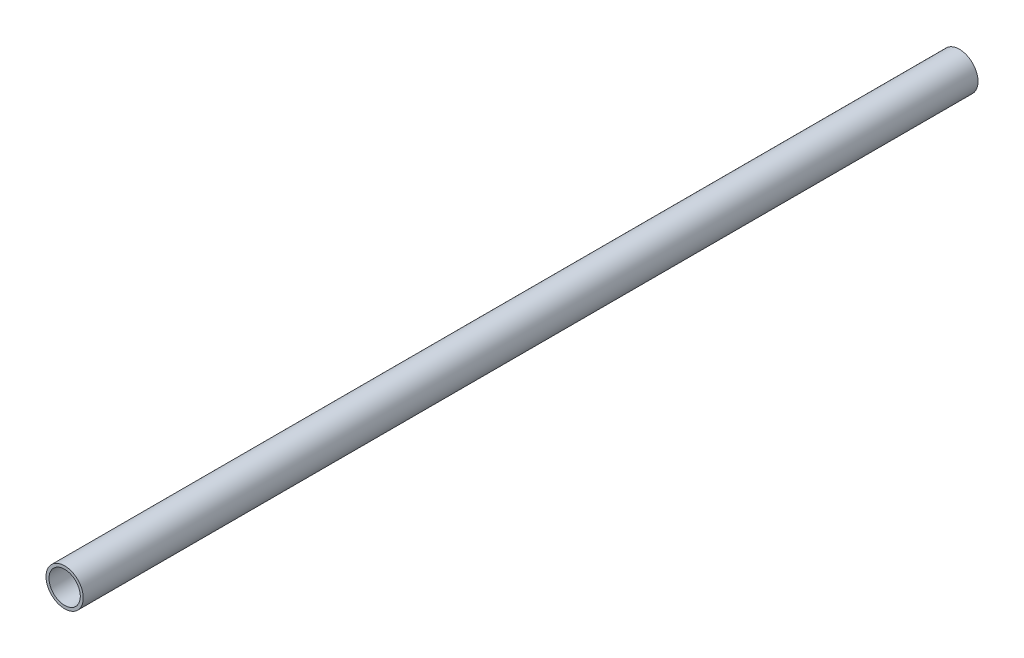
ISO-10303-21;
HEADER;
FILE_DESCRIPTION(('STEP AP214'),'2;1');
FILE_NAME('part.step','',(''),(''),'','','');
FILE_SCHEMA(('AUTOMOTIVE_DESIGN { 1 0 10303 214 1 1 1 1 }'));
ENDSEC;
DATA;
#1=APPLICATION_CONTEXT('core data for automotive mechanical design processes');
#2=APPLICATION_PROTOCOL_DEFINITION('international standard','automotive_design',2000,#1);
#3=PRODUCT_CONTEXT('',#1,'mechanical');
#4=PRODUCT('Part','Part','',(#3));
#5=PRODUCT_RELATED_PRODUCT_CATEGORY('part','',(#4));
#6=PRODUCT_DEFINITION_FORMATION('','',#4);
#7=PRODUCT_DEFINITION_CONTEXT('part definition',#1,'design');
#8=PRODUCT_DEFINITION('design','',#6,#7);
#9=PRODUCT_DEFINITION_SHAPE('','',#8);
#10=(LENGTH_UNIT() NAMED_UNIT(*) SI_UNIT(.MILLI.,.METRE.));
#11=(NAMED_UNIT(*) PLANE_ANGLE_UNIT() SI_UNIT($,.RADIAN.));
#12=(NAMED_UNIT(*) SI_UNIT($,.STERADIAN.) SOLID_ANGLE_UNIT());
#13=UNCERTAINTY_MEASURE_WITH_UNIT(LENGTH_MEASURE(1.E-05),#10,'distance_accuracy_value','');
#14=(GEOMETRIC_REPRESENTATION_CONTEXT(3) GLOBAL_UNCERTAINTY_ASSIGNED_CONTEXT((#13)) GLOBAL_UNIT_ASSIGNED_CONTEXT((#10,
#11,#12)) REPRESENTATION_CONTEXT('',''));
#15=CARTESIAN_POINT('',(0.,0.,0.));
#16=DIRECTION('',(0.,0.,1.));
#17=DIRECTION('',(1.,0.,0.));
#18=AXIS2_PLACEMENT_3D('',#15,#16,#17);
#19=CARTESIAN_POINT('',(0.,0.,76.2));
#20=DIRECTION('',(0.,0.,1.));
#21=DIRECTION('',(1.,0.,0.));
#22=AXIS2_PLACEMENT_3D('',#19,#20,#21);
#23=PLANE('',#22);
#24=CARTESIAN_POINT('',(0.,0.,76.2));
#25=DIRECTION('',(0.,0.,1.));
#26=DIRECTION('',(1.,0.,0.));
#27=AXIS2_PLACEMENT_3D('',#24,#25,#26);
#28=CIRCLE('',#27,3.175);
#29=CARTESIAN_POINT('',(-3.175,0.,76.2));
#30=VERTEX_POINT('',#29);
#31=EDGE_CURVE('E10',#30,#30,#28,.T.);
#32=ORIENTED_EDGE('',*,*,#31,.T.);
#33=EDGE_LOOP('',(#32));
#34=FACE_BOUND('',#33,.T.);
#35=CARTESIAN_POINT('',(0.,0.,76.2));
#36=DIRECTION('',(0.,0.,1.));
#37=DIRECTION('',(1.,0.,0.));
#38=AXIS2_PLACEMENT_3D('',#35,#36,#37);
#39=CIRCLE('',#38,2.667);
#40=CARTESIAN_POINT('',(-2.667,0.,76.2));
#41=VERTEX_POINT('',#40);
#42=EDGE_CURVE('E50',#41,#41,#39,.T.);
#43=ORIENTED_EDGE('',*,*,#42,.F.);
#44=EDGE_LOOP('',(#43));
#45=FACE_BOUND('',#44,.T.);
#46=ADVANCED_FACE('F37',(#34,#45),#23,.T.);
#47=CARTESIAN_POINT('',(0.,0.,-76.2));
#48=DIRECTION('',(0.,0.,1.));
#49=DIRECTION('',(1.,0.,0.));
#50=AXIS2_PLACEMENT_3D('',#47,#48,#49);
#51=PLANE('',#50);
#52=CARTESIAN_POINT('',(0.,0.,-76.2));
#53=DIRECTION('',(0.,0.,1.));
#54=DIRECTION('',(1.,0.,0.));
#55=AXIS2_PLACEMENT_3D('',#52,#53,#54);
#56=CIRCLE('',#55,3.175);
#57=CARTESIAN_POINT('',(-3.175,0.,-76.2));
#58=VERTEX_POINT('',#57);
#59=EDGE_CURVE('E41',#58,#58,#56,.T.);
#60=ORIENTED_EDGE('',*,*,#59,.F.);
#61=EDGE_LOOP('',(#60));
#62=FACE_BOUND('',#61,.T.);
#63=CARTESIAN_POINT('',(0.,0.,-76.2));
#64=DIRECTION('',(0.,0.,1.));
#65=DIRECTION('',(1.,0.,0.));
#66=AXIS2_PLACEMENT_3D('',#63,#64,#65);
#67=CIRCLE('',#66,2.667);
#68=CARTESIAN_POINT('',(-2.667,0.,-76.2));
#69=VERTEX_POINT('',#68);
#70=EDGE_CURVE('E52',#69,#69,#67,.T.);
#71=ORIENTED_EDGE('',*,*,#70,.T.);
#72=EDGE_LOOP('',(#71));
#73=FACE_BOUND('',#72,.T.);
#74=ADVANCED_FACE('F64',(#62,#73),#51,.F.);
#75=CARTESIAN_POINT('',(0.,0.,76.2));
#76=DIRECTION('',(0.,0.,-1.));
#77=DIRECTION('',(-1.,0.,0.));
#78=AXIS2_PLACEMENT_3D('',#75,#76,#77);
#79=CYLINDRICAL_SURFACE('',#78,3.175);
#80=CARTESIAN_POINT('',(-3.175,0.,76.2));
#81=CARTESIAN_POINT('',(-3.175,0.,74.6125));
#82=CARTESIAN_POINT('',(-3.175,0.,73.025));
#83=CARTESIAN_POINT('',(-3.175,0.,69.85));
#84=CARTESIAN_POINT('',(-3.175,0.,68.2625));
#85=CARTESIAN_POINT('',(-3.175,0.,65.0875));
#86=CARTESIAN_POINT('',(-3.175,0.,63.5));
#87=CARTESIAN_POINT('',(-3.175,0.,60.325));
#88=CARTESIAN_POINT('',(-3.175,0.,58.7375));
#89=CARTESIAN_POINT('',(-3.175,0.,55.5625));
#90=CARTESIAN_POINT('',(-3.175,0.,53.975));
#91=CARTESIAN_POINT('',(-3.175,0.,50.8));
#92=CARTESIAN_POINT('',(-3.175,0.,49.2125));
#93=CARTESIAN_POINT('',(-3.175,0.,46.0375));
#94=CARTESIAN_POINT('',(-3.175,0.,44.45));
#95=CARTESIAN_POINT('',(-3.175,0.,41.275));
#96=CARTESIAN_POINT('',(-3.175,0.,39.6875));
#97=CARTESIAN_POINT('',(-3.175,0.,36.5125));
#98=CARTESIAN_POINT('',(-3.175,0.,34.925));
#99=CARTESIAN_POINT('',(-3.175,0.,31.75));
#100=CARTESIAN_POINT('',(-3.175,0.,30.1625));
#101=CARTESIAN_POINT('',(-3.175,0.,26.9875));
#102=CARTESIAN_POINT('',(-3.175,0.,25.4));
#103=CARTESIAN_POINT('',(-3.175,0.,22.225));
#104=CARTESIAN_POINT('',(-3.175,0.,20.6375));
#105=CARTESIAN_POINT('',(-3.175,0.,17.4625));
#106=CARTESIAN_POINT('',(-3.175,0.,15.875));
#107=CARTESIAN_POINT('',(-3.175,0.,12.7));
#108=CARTESIAN_POINT('',(-3.175,0.,11.1125));
#109=CARTESIAN_POINT('',(-3.175,0.,7.93750000000001));
#110=CARTESIAN_POINT('',(-3.175,0.,6.35));
#111=CARTESIAN_POINT('',(-3.175,0.,3.175));
#112=CARTESIAN_POINT('',(-3.175,0.,1.5875));
#113=CARTESIAN_POINT('',(-3.175,0.,-1.5875));
#114=CARTESIAN_POINT('',(-3.175,0.,-3.175));
#115=CARTESIAN_POINT('',(-3.175,0.,-6.35));
#116=CARTESIAN_POINT('',(-3.175,0.,-7.93750000000001));
#117=CARTESIAN_POINT('',(-3.175,0.,-11.1125));
#118=CARTESIAN_POINT('',(-3.175,0.,-12.7));
#119=CARTESIAN_POINT('',(-3.175,0.,-15.875));
#120=CARTESIAN_POINT('',(-3.175,0.,-17.4625));
#121=CARTESIAN_POINT('',(-3.175,0.,-20.6375));
#122=CARTESIAN_POINT('',(-3.175,0.,-22.225));
#123=CARTESIAN_POINT('',(-3.175,0.,-25.4));
#124=CARTESIAN_POINT('',(-3.175,0.,-26.9875));
#125=CARTESIAN_POINT('',(-3.175,0.,-30.1625));
#126=CARTESIAN_POINT('',(-3.175,0.,-31.75));
#127=CARTESIAN_POINT('',(-3.175,0.,-34.925));
#128=CARTESIAN_POINT('',(-3.175,0.,-36.5125));
#129=CARTESIAN_POINT('',(-3.175,0.,-39.6875));
#130=CARTESIAN_POINT('',(-3.175,0.,-41.275));
#131=CARTESIAN_POINT('',(-3.175,0.,-44.45));
#132=CARTESIAN_POINT('',(-3.175,0.,-46.0375));
#133=CARTESIAN_POINT('',(-3.175,0.,-49.2125));
#134=CARTESIAN_POINT('',(-3.175,0.,-50.8));
#135=CARTESIAN_POINT('',(-3.175,0.,-53.975));
#136=CARTESIAN_POINT('',(-3.175,0.,-55.5625));
#137=CARTESIAN_POINT('',(-3.175,0.,-58.7375));
#138=CARTESIAN_POINT('',(-3.175,0.,-60.325));
#139=CARTESIAN_POINT('',(-3.175,0.,-63.5));
#140=CARTESIAN_POINT('',(-3.175,0.,-65.0875));
#141=CARTESIAN_POINT('',(-3.175,0.,-68.2625));
#142=CARTESIAN_POINT('',(-3.175,0.,-69.85));
#143=CARTESIAN_POINT('',(-3.175,0.,-73.025));
#144=CARTESIAN_POINT('',(-3.175,0.,-74.6125));
#145=CARTESIAN_POINT('',(-3.175,0.,-76.2));
#146=B_SPLINE_CURVE_WITH_KNOTS('',3,(#80,#81,#82,#83,#84,#85,#86,#87,#88,#89,#90,#91,#92,#93,
#94,#95,#96,#97,#98,#99,#100,#101,#102,#103,#104,#105,#106,#107,#108,#109,#110,#111,#112,#113,
#114,#115,#116,#117,#118,#119,#120,#121,#122,#123,#124,#125,#126,#127,#128,#129,#130,#131,#132,
#133,#134,#135,#136,#137,#138,#139,#140,#141,#142,#143,#144,#145),.UNSPECIFIED.,.F.,.F.,(4,2,2,
2,2,2,2,2,2,2,2,2,2,2,2,2,2,2,2,2,2,2,2,2,2,2,2,2,2,2,2,2,4),(0.,4.7625,9.52500000000001,
14.2875,19.05,23.8125,28.575,33.3375,38.1,42.8625,47.625,52.3875,57.15,61.9125,66.675,71.4375,
76.2,80.9625,85.725,90.4875,95.25,100.0125,104.775,109.5375,114.3,119.0625,123.825,128.5875,
133.35,138.1125,142.875,147.6375,152.4),.UNSPECIFIED.);
#147=EDGE_CURVE('BSEAM39',#30,#58,#146,.T.);
#148=ORIENTED_EDGE('',*,*,#31,.F.);
#149=ORIENTED_EDGE('',*,*,#59,.T.);
#150=ORIENTED_EDGE('',*,*,#147,.T.);
#151=ORIENTED_EDGE('',*,*,#147,.F.);
#152=EDGE_LOOP('',(#148,#150,#149,#151));
#153=FACE_BOUND('',#152,.T.);
#154=ADVANCED_FACE('F39',(#153),#79,.T.);
#155=CARTESIAN_POINT('',(0.,0.,76.2));
#156=DIRECTION('',(0.,0.,-1.));
#157=DIRECTION('',(-1.,0.,0.));
#158=AXIS2_PLACEMENT_3D('',#155,#156,#157);
#159=CYLINDRICAL_SURFACE('',#158,2.667);
#160=CARTESIAN_POINT('',(-2.667,0.,76.2));
#161=CARTESIAN_POINT('',(-2.667,0.,74.6125));
#162=CARTESIAN_POINT('',(-2.667,0.,73.025));
#163=CARTESIAN_POINT('',(-2.667,0.,69.85));
#164=CARTESIAN_POINT('',(-2.667,0.,68.2625));
#165=CARTESIAN_POINT('',(-2.667,0.,65.0875));
#166=CARTESIAN_POINT('',(-2.667,0.,63.5));
#167=CARTESIAN_POINT('',(-2.667,0.,60.325));
#168=CARTESIAN_POINT('',(-2.667,0.,58.7375));
#169=CARTESIAN_POINT('',(-2.667,0.,55.5625));
#170=CARTESIAN_POINT('',(-2.667,0.,53.975));
#171=CARTESIAN_POINT('',(-2.667,0.,50.8));
#172=CARTESIAN_POINT('',(-2.667,0.,49.2125));
#173=CARTESIAN_POINT('',(-2.667,0.,46.0375));
#174=CARTESIAN_POINT('',(-2.667,0.,44.45));
#175=CARTESIAN_POINT('',(-2.667,0.,41.275));
#176=CARTESIAN_POINT('',(-2.667,0.,39.6875));
#177=CARTESIAN_POINT('',(-2.667,0.,36.5125));
#178=CARTESIAN_POINT('',(-2.667,0.,34.925));
#179=CARTESIAN_POINT('',(-2.667,0.,31.75));
#180=CARTESIAN_POINT('',(-2.667,0.,30.1625));
#181=CARTESIAN_POINT('',(-2.667,0.,26.9875));
#182=CARTESIAN_POINT('',(-2.667,0.,25.4));
#183=CARTESIAN_POINT('',(-2.667,0.,22.225));
#184=CARTESIAN_POINT('',(-2.667,0.,20.6375));
#185=CARTESIAN_POINT('',(-2.667,0.,17.4625));
#186=CARTESIAN_POINT('',(-2.667,0.,15.875));
#187=CARTESIAN_POINT('',(-2.667,0.,12.7));
#188=CARTESIAN_POINT('',(-2.667,0.,11.1125));
#189=CARTESIAN_POINT('',(-2.667,0.,7.93749999999999));
#190=CARTESIAN_POINT('',(-2.667,0.,6.34999999999999));
#191=CARTESIAN_POINT('',(-2.667,0.,3.17499999999999));
#192=CARTESIAN_POINT('',(-2.667,0.,1.58749999999999));
#193=CARTESIAN_POINT('',(-2.667,0.,-1.58750000000001));
#194=CARTESIAN_POINT('',(-2.667,0.,-3.17500000000002));
#195=CARTESIAN_POINT('',(-2.667,0.,-6.35000000000002));
#196=CARTESIAN_POINT('',(-2.667,0.,-7.93750000000002));
#197=CARTESIAN_POINT('',(-2.667,0.,-11.1125));
#198=CARTESIAN_POINT('',(-2.667,0.,-12.7));
#199=CARTESIAN_POINT('',(-2.667,0.,-15.875));
#200=CARTESIAN_POINT('',(-2.667,0.,-17.4625));
#201=CARTESIAN_POINT('',(-2.667,0.,-20.6375));
#202=CARTESIAN_POINT('',(-2.667,0.,-22.225));
#203=CARTESIAN_POINT('',(-2.667,0.,-25.4));
#204=CARTESIAN_POINT('',(-2.667,0.,-26.9875));
#205=CARTESIAN_POINT('',(-2.667,0.,-30.1625));
#206=CARTESIAN_POINT('',(-2.667,0.,-31.75));
#207=CARTESIAN_POINT('',(-2.667,0.,-34.925));
#208=CARTESIAN_POINT('',(-2.667,0.,-36.5125));
#209=CARTESIAN_POINT('',(-2.667,0.,-39.6875));
#210=CARTESIAN_POINT('',(-2.667,0.,-41.275));
#211=CARTESIAN_POINT('',(-2.667,0.,-44.45));
#212=CARTESIAN_POINT('',(-2.667,0.,-46.0375));
#213=CARTESIAN_POINT('',(-2.667,0.,-49.2125));
#214=CARTESIAN_POINT('',(-2.667,0.,-50.8));
#215=CARTESIAN_POINT('',(-2.667,0.,-53.975));
#216=CARTESIAN_POINT('',(-2.667,0.,-55.5625));
#217=CARTESIAN_POINT('',(-2.667,0.,-58.7375));
#218=CARTESIAN_POINT('',(-2.667,0.,-60.325));
#219=CARTESIAN_POINT('',(-2.667,0.,-63.5));
#220=CARTESIAN_POINT('',(-2.667,0.,-65.0875));
#221=CARTESIAN_POINT('',(-2.667,0.,-68.2625));
#222=CARTESIAN_POINT('',(-2.667,0.,-69.85));
#223=CARTESIAN_POINT('',(-2.667,0.,-73.025));
#224=CARTESIAN_POINT('',(-2.667,0.,-74.6125));
#225=CARTESIAN_POINT('',(-2.667,0.,-76.2));
#226=B_SPLINE_CURVE_WITH_KNOTS('',3,(#160,#161,#162,#163,#164,#165,#166,#167,#168,#169,#170,
#171,#172,#173,#174,#175,#176,#177,#178,#179,#180,#181,#182,#183,#184,#185,#186,#187,#188,#189,
#190,#191,#192,#193,#194,#195,#196,#197,#198,#199,#200,#201,#202,#203,#204,#205,#206,#207,#208,
#209,#210,#211,#212,#213,#214,#215,#216,#217,#218,#219,#220,#221,#222,#223,#224,#225),
.UNSPECIFIED.,.F.,.F.,(4,2,2,2,2,2,2,2,2,2,2,2,2,2,2,2,2,2,2,2,2,2,2,2,2,2,2,2,2,2,2,2,4),(0.,
4.76249999999999,9.52499999999999,14.2875,19.05,23.8125,28.575,33.3375,38.1,42.8625,47.625,
52.3875,57.15,61.9125,66.675,71.4375,76.2,80.9625,85.725,90.4875,95.25,100.0125,104.775,
109.5375,114.3,119.0625,123.825,128.5875,133.35,138.1125,142.875,147.6375,152.4),.UNSPECIFIED.);
#227=EDGE_CURVE('BSEAM60',#41,#69,#226,.T.);
#228=ORIENTED_EDGE('',*,*,#42,.T.);
#229=ORIENTED_EDGE('',*,*,#70,.F.);
#230=ORIENTED_EDGE('',*,*,#227,.T.);
#231=ORIENTED_EDGE('',*,*,#227,.F.);
#232=EDGE_LOOP('',(#228,#230,#229,#231));
#233=FACE_BOUND('',#232,.T.);
#234=ADVANCED_FACE('F60',(#233),#159,.F.);
#235=CLOSED_SHELL('',(#46,#74,#154,#234));
#236=MANIFOLD_SOLID_BREP('B2',#235);
#237=ADVANCED_BREP_SHAPE_REPRESENTATION('',(#18,#236),#14);
#238=SHAPE_DEFINITION_REPRESENTATION(#9,#237);
ENDSEC;
END-ISO-10303-21;
